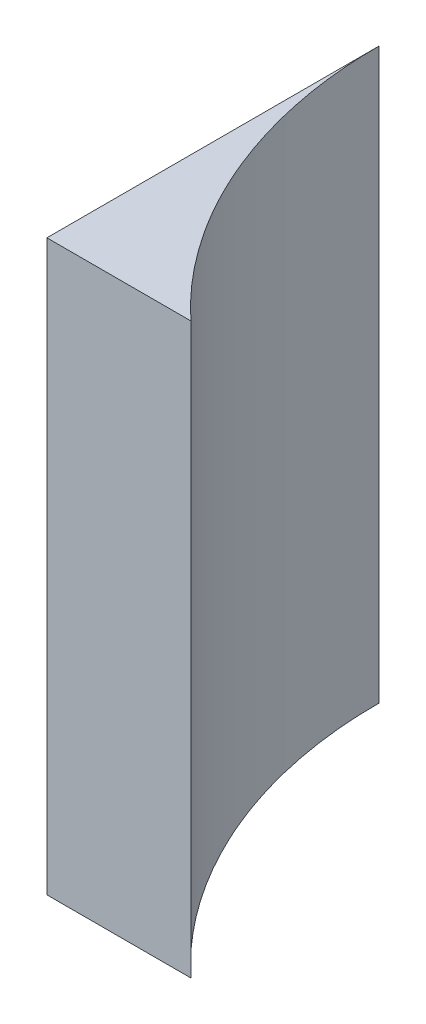
ISO-10303-21;
HEADER;
FILE_DESCRIPTION(('STEP AP214'),'2;1');
FILE_NAME('part.step','',(''),(''),'','','');
FILE_SCHEMA(('AUTOMOTIVE_DESIGN { 1 0 10303 214 1 1 1 1 }'));
ENDSEC;
DATA;
#1=APPLICATION_CONTEXT('core data for automotive mechanical design processes');
#2=APPLICATION_PROTOCOL_DEFINITION('international standard','automotive_design',2000,#1);
#3=PRODUCT_CONTEXT('',#1,'mechanical');
#4=PRODUCT('Part','Part','',(#3));
#5=PRODUCT_RELATED_PRODUCT_CATEGORY('part','',(#4));
#6=PRODUCT_DEFINITION_FORMATION('','',#4);
#7=PRODUCT_DEFINITION_CONTEXT('part definition',#1,'design');
#8=PRODUCT_DEFINITION('design','',#6,#7);
#9=PRODUCT_DEFINITION_SHAPE('','',#8);
#10=(LENGTH_UNIT() NAMED_UNIT(*) SI_UNIT(.MILLI.,.METRE.));
#11=(NAMED_UNIT(*) PLANE_ANGLE_UNIT() SI_UNIT($,.RADIAN.));
#12=(NAMED_UNIT(*) SI_UNIT($,.STERADIAN.) SOLID_ANGLE_UNIT());
#13=UNCERTAINTY_MEASURE_WITH_UNIT(LENGTH_MEASURE(1.E-05),#10,'distance_accuracy_value','');
#14=(GEOMETRIC_REPRESENTATION_CONTEXT(3) GLOBAL_UNCERTAINTY_ASSIGNED_CONTEXT((#13)) GLOBAL_UNIT_ASSIGNED_CONTEXT((#10,
#11,#12)) REPRESENTATION_CONTEXT('',''));
#15=CARTESIAN_POINT('',(0.,0.,0.));
#16=DIRECTION('',(0.,0.,1.));
#17=DIRECTION('',(1.,0.,0.));
#18=AXIS2_PLACEMENT_3D('',#15,#16,#17);
#19=CARTESIAN_POINT('',(-39.9886378183138,-5.78571873441329,1.1449145224923));
#20=DIRECTION('',(0.,-1.,0.));
#21=DIRECTION('',(1.,0.,0.));
#22=AXIS2_PLACEMENT_3D('',#19,#20,#21);
#23=PLANE('',#22);
#24=CARTESIAN_POINT('',(-39.6231700705933,-5.78571873441328,5.15404741815309));
#25=CARTESIAN_POINT('',(-39.6231700705933,-5.78571873441328,5.22702370907642));
#26=CARTESIAN_POINT('',(-39.6231700705933,-5.78571873441328,5.29999999999976));
#27=(BOUNDED_CURVE() B_SPLINE_CURVE(2,(#24,#25,#26),.UNSPECIFIED.,.F.,
.F.) B_SPLINE_CURVE_WITH_KNOTS((3,3),(0.,1.),
.UNSPECIFIED.) CURVE() GEOMETRIC_REPRESENTATION_ITEM() RATIONAL_B_SPLINE_CURVE((1.,1.,1.)) REPRESENTATION_ITEM(''));
#28=CARTESIAN_POINT('',(-39.6231700705933,-5.78571873441327,5.15404741815306));
#29=VERTEX_POINT('',#28);
#30=CARTESIAN_POINT('',(-39.6231700705933,-5.78571873441327,5.29999999999976));
#31=VERTEX_POINT('',#30);
#32=EDGE_CURVE('E60',#29,#31,#27,.T.);
#33=ORIENTED_EDGE('',*,*,#32,.T.);
#34=CARTESIAN_POINT('',(-39.6231700705933,-5.78571873441328,5.29999999999976));
#35=CARTESIAN_POINT('',(-39.5915401003071,-5.78571873441328,5.29999999999976));
#36=CARTESIAN_POINT('',(-39.559910130021,-5.78571873441328,5.29999999999976));
#37=(BOUNDED_CURVE() B_SPLINE_CURVE(2,(#34,#35,#36),.UNSPECIFIED.,.F.,
.F.) B_SPLINE_CURVE_WITH_KNOTS((3,3),(0.,1.),
.UNSPECIFIED.) CURVE() GEOMETRIC_REPRESENTATION_ITEM() RATIONAL_B_SPLINE_CURVE((1.,1.,1.)) REPRESENTATION_ITEM(''));
#38=CARTESIAN_POINT('',(-39.559910130021,-5.78571873441327,5.29999999999975));
#39=VERTEX_POINT('',#38);
#40=EDGE_CURVE('E63',#31,#39,#37,.T.);
#41=ORIENTED_EDGE('',*,*,#40,.T.);
#42=CARTESIAN_POINT('',(-39.559910130021,-5.78571873441328,5.29999999999976));
#43=CARTESIAN_POINT('',(-39.5999460971172,-5.78571873441328,5.2628452765008));
#44=CARTESIAN_POINT('',(-39.6234285340808,-5.78571873441328,5.20866687747153));
#45=CARTESIAN_POINT('',(-39.6231700705933,-5.78571873441328,5.15404741815309));
#46=(BOUNDED_CURVE() B_SPLINE_CURVE(3,(#42,#43,#44,#45),.UNSPECIFIED.,.F.,
.F.) B_SPLINE_CURVE_WITH_KNOTS((4,4),(0.,1.),
.UNSPECIFIED.) CURVE() GEOMETRIC_REPRESENTATION_ITEM() RATIONAL_B_SPLINE_CURVE((1.,1.,1.,1.)) REPRESENTATION_ITEM(''));
#47=EDGE_CURVE('E65',#39,#29,#46,.T.);
#48=ORIENTED_EDGE('',*,*,#47,.T.);
#49=EDGE_LOOP('',(#33,#41,#48));
#50=FACE_BOUND('',#49,.T.);
#51=ADVANCED_FACE('F17',(#50),#23,.F.);
#52=CARTESIAN_POINT('',(-39.6231700705933,-6.03671873441328,2.50496026168114));
#53=DIRECTION('',(1.,0.,0.));
#54=DIRECTION('',(0.,1.,0.));
#55=AXIS2_PLACEMENT_3D('',#52,#53,#54);
#56=PLANE('',#55);
#57=CARTESIAN_POINT('',(-39.6231700705933,-6.03571873441327,5.15404741815304));
#58=CARTESIAN_POINT('',(-39.6231700705933,-6.03571873441327,5.2270237090764));
#59=CARTESIAN_POINT('',(-39.6231700705933,-6.03571873441327,5.29999999999976));
#60=(BOUNDED_CURVE() B_SPLINE_CURVE(2,(#57,#58,#59),.UNSPECIFIED.,.F.,
.F.) B_SPLINE_CURVE_WITH_KNOTS((3,3),(0.,1.),
.UNSPECIFIED.) CURVE() GEOMETRIC_REPRESENTATION_ITEM() RATIONAL_B_SPLINE_CURVE((1.,1.,1.)) REPRESENTATION_ITEM(''));
#61=CARTESIAN_POINT('',(-39.6231700705933,-6.03571873441327,5.15404741815306));
#62=VERTEX_POINT('',#61);
#63=CARTESIAN_POINT('',(-39.6231700705933,-6.03571873441327,5.29999999999976));
#64=VERTEX_POINT('',#63);
#65=EDGE_CURVE('E72',#62,#64,#60,.T.);
#66=ORIENTED_EDGE('',*,*,#65,.T.);
#67=CARTESIAN_POINT('',(-39.6231700705933,-6.03571873441327,5.29999999999976));
#68=CARTESIAN_POINT('',(-39.6231700705933,-5.91071873441327,5.29999999999976));
#69=CARTESIAN_POINT('',(-39.6231700705933,-5.78571873441327,5.29999999999976));
#70=(BOUNDED_CURVE() B_SPLINE_CURVE(2,(#67,#68,#69),.UNSPECIFIED.,.F.,
.F.) B_SPLINE_CURVE_WITH_KNOTS((3,3),(0.,1.),
.UNSPECIFIED.) CURVE() GEOMETRIC_REPRESENTATION_ITEM() RATIONAL_B_SPLINE_CURVE((1.,1.,1.)) REPRESENTATION_ITEM(''));
#71=EDGE_CURVE('E77',#64,#31,#70,.T.);
#72=ORIENTED_EDGE('',*,*,#71,.T.);
#73=ORIENTED_EDGE('',*,*,#32,.F.);
#74=CARTESIAN_POINT('',(-39.6231700705933,-5.78571873441327,5.15404741815304));
#75=CARTESIAN_POINT('',(-39.6231700705933,-5.91071873441327,5.15404741815304));
#76=CARTESIAN_POINT('',(-39.6231700705933,-6.03571873441327,5.15404741815304));
#77=(BOUNDED_CURVE() B_SPLINE_CURVE(2,(#74,#75,#76),.UNSPECIFIED.,.F.,
.F.) B_SPLINE_CURVE_WITH_KNOTS((3,3),(0.,1.),
.UNSPECIFIED.) CURVE() GEOMETRIC_REPRESENTATION_ITEM() RATIONAL_B_SPLINE_CURVE((1.,1.,1.)) REPRESENTATION_ITEM(''));
#78=EDGE_CURVE('E118',#29,#62,#77,.T.);
#79=ORIENTED_EDGE('',*,*,#78,.T.);
#80=EDGE_LOOP('',(#66,#72,#73,#79));
#81=FACE_BOUND('',#80,.T.);
#82=ADVANCED_FACE('F85',(#81),#56,.F.);
#83=CARTESIAN_POINT('',(-37.261250671403,-6.03571873441329,1.1449145224922));
#84=DIRECTION('',(0.,1.,0.));
#85=DIRECTION('',(-1.,0.,0.));
#86=AXIS2_PLACEMENT_3D('',#83,#84,#85);
#87=PLANE('',#86);
#88=CARTESIAN_POINT('',(-39.559910130021,-6.03571873441328,5.29999999999976));
#89=CARTESIAN_POINT('',(-39.5915401003071,-6.03571873441328,5.29999999999976));
#90=CARTESIAN_POINT('',(-39.6231700705933,-6.03571873441328,5.29999999999976));
#91=(BOUNDED_CURVE() B_SPLINE_CURVE(2,(#88,#89,#90),.UNSPECIFIED.,.F.,
.F.) B_SPLINE_CURVE_WITH_KNOTS((3,3),(0.,1.),
.UNSPECIFIED.) CURVE() GEOMETRIC_REPRESENTATION_ITEM() RATIONAL_B_SPLINE_CURVE((1.,1.,1.)) REPRESENTATION_ITEM(''));
#92=CARTESIAN_POINT('',(-39.559910130021,-6.03571873441327,5.29999999999975));
#93=VERTEX_POINT('',#92);
#94=EDGE_CURVE('E40',#93,#64,#91,.T.);
#95=ORIENTED_EDGE('',*,*,#94,.T.);
#96=ORIENTED_EDGE('',*,*,#65,.F.);
#97=CARTESIAN_POINT('',(-39.6231700705933,-6.03571873441328,5.15404741815309));
#98=CARTESIAN_POINT('',(-39.6234285340808,-6.03571873441328,5.20866687747153));
#99=CARTESIAN_POINT('',(-39.5999460971172,-6.03571873441328,5.2628452765008));
#100=CARTESIAN_POINT('',(-39.559910130021,-6.03571873441328,5.29999999999976));
#101=(BOUNDED_CURVE() B_SPLINE_CURVE(3,(#97,#98,#99,#100),.UNSPECIFIED.,.F.,
.F.) B_SPLINE_CURVE_WITH_KNOTS((4,4),(0.,1.),
.UNSPECIFIED.) CURVE() GEOMETRIC_REPRESENTATION_ITEM() RATIONAL_B_SPLINE_CURVE((1.,1.,1.,1.)) REPRESENTATION_ITEM(''));
#102=EDGE_CURVE('E29',#62,#93,#101,.T.);
#103=ORIENTED_EDGE('',*,*,#102,.T.);
#104=EDGE_LOOP('',(#95,#96,#103));
#105=FACE_BOUND('',#104,.T.);
#106=ADVANCED_FACE('F103',(#105),#87,.F.);
#107=CARTESIAN_POINT('',(-41.1820410614753,11.0902812655867,5.2999999999997));
#108=DIRECTION('',(0.,0.,-1.));
#109=DIRECTION('',(1.,0.,0.));
#110=AXIS2_PLACEMENT_3D('',#107,#108,#109);
#111=PLANE('',#110);
#112=CARTESIAN_POINT('',(-39.559910130021,-6.0357187344133,5.29999999999976));
#113=CARTESIAN_POINT('',(-39.559910130021,-5.9107187344133,5.29999999999976));
#114=CARTESIAN_POINT('',(-39.559910130021,-5.7857187344133,5.29999999999976));
#115=(BOUNDED_CURVE() B_SPLINE_CURVE(2,(#112,#113,#114),.UNSPECIFIED.,.F.,
.F.) B_SPLINE_CURVE_WITH_KNOTS((3,3),(0.,1.),
.UNSPECIFIED.) CURVE() GEOMETRIC_REPRESENTATION_ITEM() RATIONAL_B_SPLINE_CURVE((1.,1.,1.)) REPRESENTATION_ITEM(''));
#116=EDGE_CURVE('E11',#93,#39,#115,.T.);
#117=ORIENTED_EDGE('',*,*,#116,.T.);
#118=ORIENTED_EDGE('',*,*,#40,.F.);
#119=ORIENTED_EDGE('',*,*,#71,.F.);
#120=ORIENTED_EDGE('',*,*,#94,.F.);
#121=EDGE_LOOP('',(#117,#118,#119,#120));
#122=FACE_BOUND('',#121,.T.);
#123=ADVANCED_FACE('F76',(#122),#111,.F.);
#124=CARTESIAN_POINT('',(-39.4231700705933,-5.78571873441327,5.15404741815304));
#125=DIRECTION('',(0.,-1.,0.));
#126=DIRECTION('',(0.917523922614113,0.,-0.397680589708387));
#127=AXIS2_PLACEMENT_3D('',#124,#125,#126);
#128=CYLINDRICAL_SURFACE('',#127,0.200000000000004);
#129=ORIENTED_EDGE('',*,*,#102,.F.);
#130=ORIENTED_EDGE('',*,*,#78,.F.);
#131=ORIENTED_EDGE('',*,*,#47,.F.);
#132=ORIENTED_EDGE('',*,*,#116,.F.);
#133=EDGE_LOOP('',(#129,#130,#131,#132));
#134=FACE_BOUND('',#133,.T.);
#135=ADVANCED_FACE('F184',(#134),#128,.F.);
#136=CLOSED_SHELL('',(#51,#82,#106,#123,#135));
#137=MANIFOLD_SOLID_BREP('B1',#136);
#138=ADVANCED_BREP_SHAPE_REPRESENTATION('',(#18,#137),#14);
#139=SHAPE_DEFINITION_REPRESENTATION(#9,#138);
ENDSEC;
END-ISO-10303-21;
